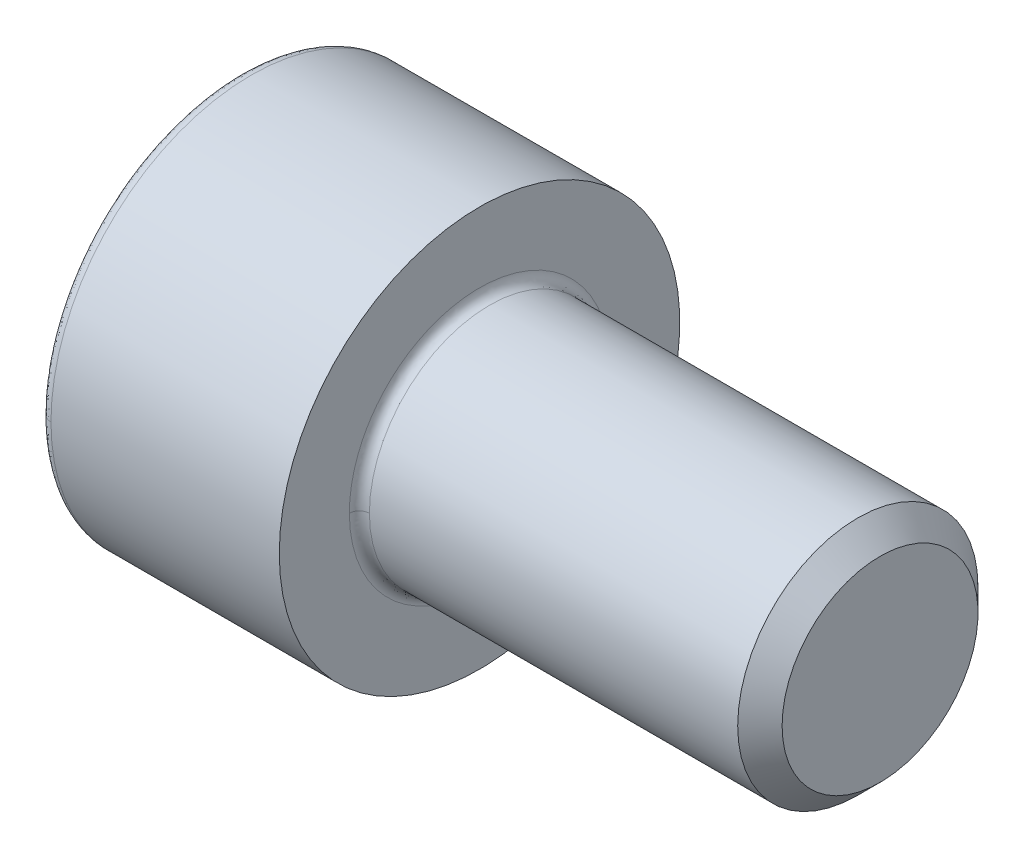
ISO-10303-21;
HEADER;
FILE_DESCRIPTION(('STEP AP214'),'2;1');
FILE_NAME('part.step','',(''),(''),'','','');
FILE_SCHEMA(('AUTOMOTIVE_DESIGN { 1 0 10303 214 1 1 1 1 }'));
ENDSEC;
DATA;
#1=APPLICATION_CONTEXT('core data for automotive mechanical design processes');
#2=APPLICATION_PROTOCOL_DEFINITION('international standard','automotive_design',2000,#1);
#3=PRODUCT_CONTEXT('',#1,'mechanical');
#4=PRODUCT('Part','Part','',(#3));
#5=PRODUCT_RELATED_PRODUCT_CATEGORY('part','',(#4));
#6=PRODUCT_DEFINITION_FORMATION('','',#4);
#7=PRODUCT_DEFINITION_CONTEXT('part definition',#1,'design');
#8=PRODUCT_DEFINITION('design','',#6,#7);
#9=PRODUCT_DEFINITION_SHAPE('','',#8);
#10=(LENGTH_UNIT() NAMED_UNIT(*) SI_UNIT(.MILLI.,.METRE.));
#11=(NAMED_UNIT(*) PLANE_ANGLE_UNIT() SI_UNIT($,.RADIAN.));
#12=(NAMED_UNIT(*) SI_UNIT($,.STERADIAN.) SOLID_ANGLE_UNIT());
#13=UNCERTAINTY_MEASURE_WITH_UNIT(LENGTH_MEASURE(1.E-05),#10,'distance_accuracy_value','');
#14=(GEOMETRIC_REPRESENTATION_CONTEXT(3) GLOBAL_UNCERTAINTY_ASSIGNED_CONTEXT((#13)) GLOBAL_UNIT_ASSIGNED_CONTEXT((#10,
#11,#12)) REPRESENTATION_CONTEXT('',''));
#15=CARTESIAN_POINT('',(0.,0.,0.));
#16=DIRECTION('',(0.,0.,1.));
#17=DIRECTION('',(1.,0.,0.));
#18=AXIS2_PLACEMENT_3D('',#15,#16,#17);
#19=CARTESIAN_POINT('',(16.,-2.474846,2.474846));
#20=DIRECTION('',(1.,0.,0.));
#21=DIRECTION('',(0.,0.,-1.));
#22=AXIS2_PLACEMENT_3D('',#19,#20,#21);
#23=PLANE('',#22);
#24=CARTESIAN_POINT('',(16.,0.,0.));
#25=DIRECTION('',(-1.,0.,0.));
#26=DIRECTION('',(0.,0.,1.));
#27=AXIS2_PLACEMENT_3D('',#24,#25,#26);
#28=CIRCLE('',#27,2.44549999999999);
#29=CARTESIAN_POINT('',(16.,0.,2.44549999999999));
#30=VERTEX_POINT('',#29);
#31=EDGE_CURVE('E21',#30,#30,#28,.F.);
#32=ORIENTED_EDGE('',*,*,#31,.T.);
#33=EDGE_LOOP('',(#32));
#34=FACE_BOUND('',#33,.T.);
#35=ADVANCED_FACE('F17',(#34),#23,.T.);
#36=CARTESIAN_POINT('',(16.,0.,0.));
#37=DIRECTION('',(-1.,0.,0.));
#38=DIRECTION('',(0.,0.,1.));
#39=AXIS2_PLACEMENT_3D('',#36,#37,#38);
#40=CONICAL_SURFACE('',#39,2.4455,0.785398163397449);
#41=CARTESIAN_POINT('',(15.4455,0.,0.));
#42=DIRECTION('',(-1.,0.,0.));
#43=DIRECTION('',(0.,0.,1.));
#44=AXIS2_PLACEMENT_3D('',#41,#42,#43);
#45=CIRCLE('',#44,3.);
#46=CARTESIAN_POINT('',(15.4455,0.,3.));
#47=VERTEX_POINT('',#46);
#48=EDGE_CURVE('E331',#47,#47,#45,.F.);
#49=ORIENTED_EDGE('',*,*,#48,.T.);
#50=EDGE_LOOP('',(#49));
#51=FACE_BOUND('',#50,.T.);
#52=ORIENTED_EDGE('',*,*,#31,.F.);
#53=EDGE_LOOP('',(#52));
#54=FACE_BOUND('',#53,.T.);
#55=ADVANCED_FACE('F421',(#51,#54),#40,.T.);
#56=CARTESIAN_POINT('',(15.4455,0.,0.));
#57=DIRECTION('',(-1.,0.,0.));
#58=DIRECTION('',(0.,0.,1.));
#59=AXIS2_PLACEMENT_3D('',#56,#57,#58);
#60=CYLINDRICAL_SURFACE('',#59,3.);
#61=CARTESIAN_POINT('',(6.24999999978248,0.,0.));
#62=DIRECTION('',(1.,0.,0.));
#63=DIRECTION('',(0.,0.,-1.));
#64=AXIS2_PLACEMENT_3D('',#61,#62,#63);
#65=CIRCLE('',#64,3.00000000023549);
#66=CARTESIAN_POINT('',(6.24999999978248,-3.07655142772997E-10,-3.00000000017662));
#67=VERTEX_POINT('',#66);
#68=CARTESIAN_POINT('',(6.24999999983686,0.,3.00000000017662));
#69=VERTEX_POINT('',#68);
#70=EDGE_CURVE('E334',#67,#69,#65,.T.);
#71=ORIENTED_EDGE('',*,*,#70,.T.);
#72=CARTESIAN_POINT('',(6.24999999978248,0.,0.));
#73=DIRECTION('',(1.,0.,0.));
#74=DIRECTION('',(0.,0.,-1.));
#75=AXIS2_PLACEMENT_3D('',#72,#73,#74);
#76=CIRCLE('',#75,3.00000000023549);
#77=EDGE_CURVE('E323',#69,#67,#76,.T.);
#78=ORIENTED_EDGE('',*,*,#77,.T.);
#79=EDGE_LOOP('',(#71,#78));
#80=FACE_BOUND('',#79,.T.);
#81=ORIENTED_EDGE('',*,*,#48,.F.);
#82=EDGE_LOOP('',(#81));
#83=FACE_BOUND('',#82,.T.);
#84=ADVANCED_FACE('F308',(#80,#83),#60,.T.);
#85=CARTESIAN_POINT('',(6.001248959,0.,3.274958354));
#86=CARTESIAN_POINT('',(6.001248959,-6.549916708,3.274958354));
#87=CARTESIAN_POINT('',(6.001248959,-6.549916708,-3.274958354));
#88=CARTESIAN_POINT('',(6.001248959,0.,-3.274958354));
#89=CARTESIAN_POINT('',(5.984194894,0.,3.104986559));
#90=CARTESIAN_POINT('',(5.984194894,-6.209973117,3.104986559));
#91=CARTESIAN_POINT('',(5.984194894,-6.209973117,-3.104986559));
#92=CARTESIAN_POINT('',(5.984194894,0.,-3.104986559));
#93=CARTESIAN_POINT('',(6.104986559,0.,2.984194894));
#94=CARTESIAN_POINT('',(6.104986559,-5.968389789,2.984194894));
#95=CARTESIAN_POINT('',(6.104986559,-5.968389789,-2.984194894));
#96=CARTESIAN_POINT('',(6.104986559,0.,-2.984194894));
#97=CARTESIAN_POINT('',(6.274958354,0.,3.001248959));
#98=CARTESIAN_POINT('',(6.274958354,-6.002497917,3.001248959));
#99=CARTESIAN_POINT('',(6.274958354,-6.002497917,-3.001248959));
#100=CARTESIAN_POINT('',(6.274958354,0.,-3.001248959));
#101=(BOUNDED_SURFACE() B_SPLINE_SURFACE(3,3,((#85,#86,#87,#88),(#89,#90,#91,#92),(#93,#94,#95,
#96),(#97,#98,#99,#100)),.UNSPECIFIED.,.F.,.F.,.F.) B_SPLINE_SURFACE_WITH_KNOTS((4,4),(4,4),(0.,
1.),(0.,1.),.UNSPECIFIED.) GEOMETRIC_REPRESENTATION_ITEM() RATIONAL_B_SPLINE_SURFACE(((1.,
0.333333333333333,0.333333333333333,1.),(0.755320871117972,0.251773623705991,0.251773623705991,
0.755320871117972),(0.755320871117972,0.251773623705991,0.251773623705991,0.755320871117972),
(1.,0.333333333333333,0.333333333333333,1.))) REPRESENTATION_ITEM('') SURFACE());
#102=CARTESIAN_POINT('',(6.001248959,0.,3.274958354));
#103=CARTESIAN_POINT('',(5.984194894,0.,3.104986559));
#104=CARTESIAN_POINT('',(6.104986559,0.,2.984194894));
#105=CARTESIAN_POINT('',(6.274958354,0.,3.001248959));
#106=(BOUNDED_CURVE() B_SPLINE_CURVE(3,(#102,#103,#104,#105),.UNSPECIFIED.,.F.,
.F.) B_SPLINE_CURVE_WITH_KNOTS((4,4),(0.,1.),
.UNSPECIFIED.) CURVE() GEOMETRIC_REPRESENTATION_ITEM() RATIONAL_B_SPLINE_CURVE((1.,
0.755320871117972,0.755320871117972,1.)) REPRESENTATION_ITEM(''));
#107=CARTESIAN_POINT('',(6.00000000014129,0.,3.24999999964183));
#108=VERTEX_POINT('',#107);
#109=EDGE_CURVE('E283',#69,#108,#106,.F.);
#110=CARTESIAN_POINT('',(6.00000000023549,0.,3.24999999981333));
#111=CARTESIAN_POINT('',(6.00000000023549,-6.49999999950396,3.24999999981333));
#112=CARTESIAN_POINT('',(6.00000000023549,-6.49999999950396,-3.24999999981333));
#113=CARTESIAN_POINT('',(6.00000000023549,0.,-3.24999999981333));
#114=(BOUNDED_CURVE() B_SPLINE_CURVE(3,(#110,#111,#112,#113),.UNSPECIFIED.,.F.,
.F.) B_SPLINE_CURVE_WITH_KNOTS((4,4),(0.,1.),
.UNSPECIFIED.) CURVE() GEOMETRIC_REPRESENTATION_ITEM() RATIONAL_B_SPLINE_CURVE((0.95657830221489,
0.31885943407163,0.31885943407163,0.95657830221489)) REPRESENTATION_ITEM(''));
#115=CARTESIAN_POINT('',(6.00000000014129,0.,-3.24999999964183));
#116=VERTEX_POINT('',#115);
#117=EDGE_CURVE('E343',#116,#108,#114,.F.);
#118=CARTESIAN_POINT('',(6.001248959,0.,-3.274958354));
#119=CARTESIAN_POINT('',(5.984194894,0.,-3.104986559));
#120=CARTESIAN_POINT('',(6.104986559,0.,-2.984194894));
#121=CARTESIAN_POINT('',(6.274958354,0.,-3.001248959));
#122=(BOUNDED_CURVE() B_SPLINE_CURVE(3,(#118,#119,#120,#121),.UNSPECIFIED.,.F.,
.F.) B_SPLINE_CURVE_WITH_KNOTS((4,4),(0.,1.),
.UNSPECIFIED.) CURVE() GEOMETRIC_REPRESENTATION_ITEM() RATIONAL_B_SPLINE_CURVE((1.,
0.755320871117972,0.755320871117972,1.)) REPRESENTATION_ITEM(''));
#123=EDGE_CURVE('E330',#116,#67,#122,.T.);
#124=ORIENTED_EDGE('',*,*,#109,.T.);
#125=ORIENTED_EDGE('',*,*,#117,.F.);
#126=ORIENTED_EDGE('',*,*,#123,.T.);
#127=ORIENTED_EDGE('',*,*,#77,.F.);
#128=EDGE_LOOP('',(#124,#125,#126,#127));
#129=FACE_BOUND('',#128,.T.);
#130=ADVANCED_FACE('F297',(#129),#101,.F.);
#131=CARTESIAN_POINT('',(6.001248959,0.,-3.274958354));
#132=CARTESIAN_POINT('',(6.001248959,6.549916708,-3.274958354));
#133=CARTESIAN_POINT('',(6.001248959,6.549916708,3.274958354));
#134=CARTESIAN_POINT('',(6.001248959,0.,3.274958354));
#135=CARTESIAN_POINT('',(5.984194894,0.,-3.104986559));
#136=CARTESIAN_POINT('',(5.984194894,6.209973117,-3.104986559));
#137=CARTESIAN_POINT('',(5.984194894,6.209973117,3.104986559));
#138=CARTESIAN_POINT('',(5.984194894,0.,3.104986559));
#139=CARTESIAN_POINT('',(6.104986559,0.,-2.984194894));
#140=CARTESIAN_POINT('',(6.104986559,5.968389789,-2.984194894));
#141=CARTESIAN_POINT('',(6.104986559,5.968389789,2.984194894));
#142=CARTESIAN_POINT('',(6.104986559,0.,2.984194894));
#143=CARTESIAN_POINT('',(6.274958354,0.,-3.001248959));
#144=CARTESIAN_POINT('',(6.274958354,6.002497917,-3.001248959));
#145=CARTESIAN_POINT('',(6.274958354,6.002497917,3.001248959));
#146=CARTESIAN_POINT('',(6.274958354,0.,3.001248959));
#147=(BOUNDED_SURFACE() B_SPLINE_SURFACE(3,3,((#131,#132,#133,#134),(#135,#136,#137,#138),(#139,
#140,#141,#142),(#143,#144,#145,#146)),.UNSPECIFIED.,.F.,.F.,
.F.) B_SPLINE_SURFACE_WITH_KNOTS((4,4),(4,4),(0.,1.),(0.,1.),
.UNSPECIFIED.) GEOMETRIC_REPRESENTATION_ITEM() RATIONAL_B_SPLINE_SURFACE(((1.,0.333333333333333,
0.333333333333333,1.),(0.755320871117972,0.251773623705991,0.251773623705991,0.755320871117972),
(0.755320871117972,0.251773623705991,0.251773623705991,0.755320871117972),(1.,0.333333333333333,
0.333333333333333,1.))) REPRESENTATION_ITEM('') SURFACE());
#148=CARTESIAN_POINT('',(6.00000000023549,0.,-3.24999999981333));
#149=CARTESIAN_POINT('',(6.00000000023549,6.49999999950396,-3.24999999981333));
#150=CARTESIAN_POINT('',(6.00000000023549,6.49999999950396,3.24999999981333));
#151=CARTESIAN_POINT('',(6.00000000023549,0.,3.24999999981333));
#152=(BOUNDED_CURVE() B_SPLINE_CURVE(3,(#148,#149,#150,#151),.UNSPECIFIED.,.F.,
.F.) B_SPLINE_CURVE_WITH_KNOTS((4,4),(0.,1.),
.UNSPECIFIED.) CURVE() GEOMETRIC_REPRESENTATION_ITEM() RATIONAL_B_SPLINE_CURVE((0.956578302214891,
0.31885943407163,0.31885943407163,0.956578302214891)) REPRESENTATION_ITEM(''));
#153=EDGE_CURVE('E279',#108,#116,#152,.F.);
#154=ORIENTED_EDGE('',*,*,#70,.F.);
#155=ORIENTED_EDGE('',*,*,#123,.F.);
#156=ORIENTED_EDGE('',*,*,#153,.F.);
#157=ORIENTED_EDGE('',*,*,#109,.F.);
#158=EDGE_LOOP('',(#154,#155,#156,#157));
#159=FACE_BOUND('',#158,.T.);
#160=ADVANCED_FACE('F285',(#159),#147,.F.);
#161=CARTESIAN_POINT('',(6.,-5.06,5.06));
#162=DIRECTION('',(1.,0.,0.));
#163=DIRECTION('',(0.,0.,-1.));
#164=AXIS2_PLACEMENT_3D('',#161,#162,#163);
#165=PLANE('',#164);
#166=ORIENTED_EDGE('',*,*,#117,.T.);
#167=ORIENTED_EDGE('',*,*,#153,.T.);
#168=EDGE_LOOP('',(#166,#167));
#169=FACE_BOUND('',#168,.T.);
#170=CARTESIAN_POINT('',(6.,0.,0.));
#171=DIRECTION('',(-1.,0.,0.));
#172=DIRECTION('',(0.,0.,1.));
#173=AXIS2_PLACEMENT_3D('',#170,#171,#172);
#174=CIRCLE('',#173,5.);
#175=CARTESIAN_POINT('',(6.,0.,5.));
#176=VERTEX_POINT('',#175);
#177=EDGE_CURVE('E267',#176,#176,#174,.F.);
#178=ORIENTED_EDGE('',*,*,#177,.T.);
#179=EDGE_LOOP('',(#178));
#180=FACE_BOUND('',#179,.T.);
#181=ADVANCED_FACE('F296',(#169,#180),#165,.T.);
#182=CARTESIAN_POINT('',(6.,0.,0.));
#183=DIRECTION('',(-1.,0.,0.));
#184=DIRECTION('',(0.,0.,1.));
#185=AXIS2_PLACEMENT_3D('',#182,#183,#184);
#186=CYLINDRICAL_SURFACE('',#185,5.);
#187=ORIENTED_EDGE('',*,*,#177,.F.);
#188=EDGE_LOOP('',(#187));
#189=FACE_BOUND('',#188,.T.);
#190=CARTESIAN_POINT('',(0.29999999980743,0.,0.));
#191=DIRECTION('',(-1.,0.,0.));
#192=DIRECTION('',(0.,-1.,0.));
#193=AXIS2_PLACEMENT_3D('',#190,#191,#192);
#194=CIRCLE('',#193,5.00000000038587);
#195=CARTESIAN_POINT('',(0.299999999855573,-2.24484071071833E-10,5.0000000002894));
#196=VERTEX_POINT('',#195);
#197=CARTESIAN_POINT('',(0.29999999980743,-5.12758571288328E-10,-5.0000000002894));
#198=VERTEX_POINT('',#197);
#199=EDGE_CURVE('E264',#196,#198,#194,.T.);
#200=ORIENTED_EDGE('',*,*,#199,.F.);
#201=CARTESIAN_POINT('',(0.29999999980743,0.,0.));
#202=DIRECTION('',(-1.,0.,0.));
#203=DIRECTION('',(0.,-1.,0.));
#204=AXIS2_PLACEMENT_3D('',#201,#202,#203);
#205=CIRCLE('',#204,5.00000000038587);
#206=EDGE_CURVE('E270',#198,#196,#205,.T.);
#207=ORIENTED_EDGE('',*,*,#206,.F.);
#208=EDGE_LOOP('',(#200,#207));
#209=FACE_BOUND('',#208,.T.);
#210=ADVANCED_FACE('F216',(#189,#209),#186,.T.);
#211=CARTESIAN_POINT('',(0.00149875,0.,4.670049975));
#212=CARTESIAN_POINT('',(0.00149875,9.34009995,4.670049975));
#213=CARTESIAN_POINT('',(0.00149875,9.34009995,-4.670049975));
#214=CARTESIAN_POINT('',(0.00149875,0.,-4.670049975));
#215=CARTESIAN_POINT('',(-0.018966127,0.,4.87401613));
#216=CARTESIAN_POINT('',(-0.018966127,9.748032259,4.87401613));
#217=CARTESIAN_POINT('',(-0.018966127,9.748032259,-4.87401613));
#218=CARTESIAN_POINT('',(-0.018966127,0.,-4.87401613));
#219=CARTESIAN_POINT('',(0.12598387,0.,5.018966127));
#220=CARTESIAN_POINT('',(0.12598387,10.037932254,5.018966127));
#221=CARTESIAN_POINT('',(0.12598387,10.037932254,-5.018966127));
#222=CARTESIAN_POINT('',(0.12598387,0.,-5.018966127));
#223=CARTESIAN_POINT('',(0.329950025,0.,4.99850125));
#224=CARTESIAN_POINT('',(0.329950025,9.997002499,4.99850125));
#225=CARTESIAN_POINT('',(0.329950025,9.997002499,-4.99850125));
#226=CARTESIAN_POINT('',(0.329950025,0.,-4.99850125));
#227=(BOUNDED_SURFACE() B_SPLINE_SURFACE(3,3,((#211,#212,#213,#214),(#215,#216,#217,#218),(#219,
#220,#221,#222),(#223,#224,#225,#226)),.UNSPECIFIED.,.F.,.F.,
.F.) B_SPLINE_SURFACE_WITH_KNOTS((4,4),(4,4),(0.,1.),(0.,1.),
.UNSPECIFIED.) GEOMETRIC_REPRESENTATION_ITEM() RATIONAL_B_SPLINE_SURFACE(((1.,0.333333333333333,
0.333333333333333,1.),(0.755320871117972,0.251773623705991,0.251773623705991,0.755320871117972),
(0.755320871117972,0.251773623705991,0.251773623705991,0.755320871117972),(1.,0.333333333333333,
0.333333333333333,1.))) REPRESENTATION_ITEM('') SURFACE());
#228=CARTESIAN_POINT('',(-3.85867261707578E-10,0.,-4.70000000022572));
#229=CARTESIAN_POINT('',(-3.85867264776779E-10,9.4000000003199,-4.70000000022572));
#230=CARTESIAN_POINT('',(-3.85867264776779E-10,9.4000000003199,4.70000000022572));
#231=CARTESIAN_POINT('',(-3.85867261707578E-10,0.,4.70000000022572));
#232=(BOUNDED_CURVE() B_SPLINE_CURVE(3,(#228,#229,#230,#231),.UNSPECIFIED.,.F.,
.F.) B_SPLINE_CURVE_WITH_KNOTS((4,4),(0.,1.),
.UNSPECIFIED.) CURVE() GEOMETRIC_REPRESENTATION_ITEM() RATIONAL_B_SPLINE_CURVE((0.95657830212221,
0.318859434040737,0.318859434040737,0.95657830212221)) REPRESENTATION_ITEM(''));
#233=CARTESIAN_POINT('',(-2.3152035707117E-10,0.,4.69999999919632));
#234=VERTEX_POINT('',#233);
#235=CARTESIAN_POINT('',(-2.3152035707117E-10,0.,-4.69999999919632));
#236=VERTEX_POINT('',#235);
#237=EDGE_CURVE('E157',#234,#236,#232,.F.);
#238=CARTESIAN_POINT('',(0.00149875,0.,4.670049975));
#239=CARTESIAN_POINT('',(-0.018966127,0.,4.87401613));
#240=CARTESIAN_POINT('',(0.12598387,0.,5.018966127));
#241=CARTESIAN_POINT('',(0.329950025,0.,4.99850125));
#242=(BOUNDED_CURVE() B_SPLINE_CURVE(3,(#238,#239,#240,#241),.UNSPECIFIED.,.F.,
.F.) B_SPLINE_CURVE_WITH_KNOTS((4,4),(0.,1.),
.UNSPECIFIED.) CURVE() GEOMETRIC_REPRESENTATION_ITEM() RATIONAL_B_SPLINE_CURVE((1.,
0.755320871117972,0.755320871117972,1.)) REPRESENTATION_ITEM(''));
#243=EDGE_CURVE('E189',#196,#234,#242,.F.);
#244=CARTESIAN_POINT('',(0.00149875,0.,-4.670049975));
#245=CARTESIAN_POINT('',(-0.018966127,0.,-4.87401613));
#246=CARTESIAN_POINT('',(0.12598387,0.,-5.018966127));
#247=CARTESIAN_POINT('',(0.329950025,0.,-4.99850125));
#248=(BOUNDED_CURVE() B_SPLINE_CURVE(3,(#244,#245,#246,#247),.UNSPECIFIED.,.F.,
.F.) B_SPLINE_CURVE_WITH_KNOTS((4,4),(0.,1.),
.UNSPECIFIED.) CURVE() GEOMETRIC_REPRESENTATION_ITEM() RATIONAL_B_SPLINE_CURVE((1.,
0.755320871117972,0.755320871117972,1.)) REPRESENTATION_ITEM(''));
#249=EDGE_CURVE('E266',#236,#198,#248,.T.);
#250=ORIENTED_EDGE('',*,*,#237,.F.);
#251=ORIENTED_EDGE('',*,*,#243,.F.);
#252=ORIENTED_EDGE('',*,*,#199,.T.);
#253=ORIENTED_EDGE('',*,*,#249,.F.);
#254=EDGE_LOOP('',(#250,#251,#252,#253));
#255=FACE_BOUND('',#254,.T.);
#256=ADVANCED_FACE('F204',(#255),#227,.T.);
#257=CARTESIAN_POINT('',(0.00149875,0.,-4.670049975));
#258=CARTESIAN_POINT('',(0.00149875,-9.34009995,-4.670049975));
#259=CARTESIAN_POINT('',(0.00149875,-9.34009995,4.670049975));
#260=CARTESIAN_POINT('',(0.00149875,0.,4.670049975));
#261=CARTESIAN_POINT('',(-0.018966127,0.,-4.87401613));
#262=CARTESIAN_POINT('',(-0.018966127,-9.748032259,-4.87401613));
#263=CARTESIAN_POINT('',(-0.018966127,-9.748032259,4.87401613));
#264=CARTESIAN_POINT('',(-0.018966127,0.,4.87401613));
#265=CARTESIAN_POINT('',(0.12598387,0.,-5.018966127));
#266=CARTESIAN_POINT('',(0.12598387,-10.037932254,-5.018966127));
#267=CARTESIAN_POINT('',(0.12598387,-10.037932254,5.018966127));
#268=CARTESIAN_POINT('',(0.12598387,0.,5.018966127));
#269=CARTESIAN_POINT('',(0.329950025,0.,-4.99850125));
#270=CARTESIAN_POINT('',(0.329950025,-9.997002499,-4.99850125));
#271=CARTESIAN_POINT('',(0.329950025,-9.997002499,4.99850125));
#272=CARTESIAN_POINT('',(0.329950025,0.,4.99850125));
#273=(BOUNDED_SURFACE() B_SPLINE_SURFACE(3,3,((#257,#258,#259,#260),(#261,#262,#263,#264),(#265,
#266,#267,#268),(#269,#270,#271,#272)),.UNSPECIFIED.,.F.,.F.,
.F.) B_SPLINE_SURFACE_WITH_KNOTS((4,4),(4,4),(0.,1.),(0.,1.),
.UNSPECIFIED.) GEOMETRIC_REPRESENTATION_ITEM() RATIONAL_B_SPLINE_SURFACE(((1.,0.333333333333333,
0.333333333333333,1.),(0.755320871117972,0.251773623705991,0.251773623705991,0.755320871117972),
(0.755320871117972,0.251773623705991,0.251773623705991,0.755320871117972),(1.,0.333333333333333,
0.333333333333333,1.))) REPRESENTATION_ITEM('') SURFACE());
#274=CARTESIAN_POINT('',(-3.85867261925231E-10,0.,4.70000000022572));
#275=CARTESIAN_POINT('',(-3.85867264679281E-10,-9.4000000003199,4.70000000022572));
#276=CARTESIAN_POINT('',(-3.85867264679281E-10,-9.4000000003199,-4.70000000022572));
#277=CARTESIAN_POINT('',(-3.85867261925231E-10,0.,-4.70000000022572));
#278=(BOUNDED_CURVE() B_SPLINE_CURVE(3,(#274,#275,#276,#277),.UNSPECIFIED.,.F.,
.F.) B_SPLINE_CURVE_WITH_KNOTS((4,4),(0.,1.),
.UNSPECIFIED.) CURVE() GEOMETRIC_REPRESENTATION_ITEM() RATIONAL_B_SPLINE_CURVE((0.95657830212221,
0.318859434040737,0.318859434040737,0.95657830212221)) REPRESENTATION_ITEM(''));
#279=EDGE_CURVE('E132',#236,#234,#278,.F.);
#280=ORIENTED_EDGE('',*,*,#243,.T.);
#281=ORIENTED_EDGE('',*,*,#279,.F.);
#282=ORIENTED_EDGE('',*,*,#249,.T.);
#283=ORIENTED_EDGE('',*,*,#206,.T.);
#284=EDGE_LOOP('',(#280,#281,#282,#283));
#285=FACE_BOUND('',#284,.T.);
#286=ADVANCED_FACE('F191',(#285),#273,.T.);
#287=CARTESIAN_POINT('',(0.,1.467624384,2.542));
#288=DIRECTION('',(0.,0.,1.));
#289=DIRECTION('',(0.,-1.,0.));
#290=AXIS2_PLACEMENT_3D('',#287,#288,#289);
#291=PLANE('',#290);
#292=DIRECTION('',(-1.,0.,0.));
#293=VECTOR('',#292,1.);
#294=CARTESIAN_POINT('',(1.5,1.467624384,2.542));
#295=LINE('',#294,#293);
#296=CARTESIAN_POINT('',(3.,1.467624384,2.542));
#297=VERTEX_POINT('',#296);
#298=CARTESIAN_POINT('',(0.,1.4676243852548,2.541999999613));
#299=VERTEX_POINT('',#298);
#300=EDGE_CURVE('E128',#297,#299,#295,.T.);
#301=ORIENTED_EDGE('',*,*,#300,.F.);
#302=DIRECTION('',(0.,1.,0.));
#303=VECTOR('',#302,1.);
#304=CARTESIAN_POINT('',(3.,0.,2.542));
#305=LINE('',#304,#303);
#306=CARTESIAN_POINT('',(3.,-2.28255403465839E-10,2.542));
#307=VERTEX_POINT('',#306);
#308=EDGE_CURVE('E172',#307,#297,#305,.T.);
#309=ORIENTED_EDGE('',*,*,#308,.F.);
#310=DIRECTION('',(0.,1.,0.));
#311=VECTOR('',#310,1.);
#312=CARTESIAN_POINT('',(3.,0.,2.542));
#313=LINE('',#312,#311);
#314=CARTESIAN_POINT('',(3.,-1.467624384,2.542));
#315=VERTEX_POINT('',#314);
#316=EDGE_CURVE('E245',#315,#307,#313,.T.);
#317=ORIENTED_EDGE('',*,*,#316,.F.);
#318=DIRECTION('',(1.,0.,0.));
#319=VECTOR('',#318,1.);
#320=CARTESIAN_POINT('',(1.5,-1.467624384,2.542));
#321=LINE('',#320,#319);
#322=CARTESIAN_POINT('',(0.,-1.4676243852548,2.541999999613));
#323=VERTEX_POINT('',#322);
#324=EDGE_CURVE('E168',#323,#315,#321,.T.);
#325=ORIENTED_EDGE('',*,*,#324,.F.);
#326=DIRECTION('',(0.,-1.,0.));
#327=VECTOR('',#326,1.);
#328=CARTESIAN_POINT('',(0.,0.,2.541999999484));
#329=LINE('',#328,#327);
#330=EDGE_CURVE('E131',#299,#323,#329,.T.);
#331=ORIENTED_EDGE('',*,*,#330,.F.);
#332=EDGE_LOOP('',(#301,#309,#317,#325,#331));
#333=FACE_BOUND('',#332,.T.);
#334=ADVANCED_FACE('F203',(#333),#291,.F.);
#335=CARTESIAN_POINT('',(0.,-2.935248769,0.));
#336=DIRECTION('',(0.,0.866025403678227,-0.500000000183963));
#337=DIRECTION('',(0.,0.500000000183963,0.866025403678227));
#338=AXIS2_PLACEMENT_3D('',#335,#336,#337);
#339=PLANE('',#338);
#340=DIRECTION('',(0.,-0.500000000183963,-0.866025403678227));
#341=VECTOR('',#340,1.);
#342=CARTESIAN_POINT('',(3.,-2.2014365765,1.271));
#343=LINE('',#342,#341);
#344=CARTESIAN_POINT('',(3.,-2.20143657635501,1.27100000025113));
#345=VERTEX_POINT('',#344);
#346=CARTESIAN_POINT('',(3.,-2.935248769,0.));
#347=VERTEX_POINT('',#346);
#348=EDGE_CURVE('E165',#345,#347,#343,.T.);
#349=ORIENTED_EDGE('',*,*,#348,.T.);
#350=DIRECTION('',(1.,0.,0.));
#351=VECTOR('',#350,1.);
#352=CARTESIAN_POINT('',(1.5,-2.935248769,0.));
#353=LINE('',#352,#351);
#354=CARTESIAN_POINT('',(0.,-2.9352487717632,4.35090866656742E-10));
#355=VERTEX_POINT('',#354);
#356=EDGE_CURVE('E161',#355,#347,#353,.T.);
#357=ORIENTED_EDGE('',*,*,#356,.F.);
#358=DIRECTION('',(0.,-0.50000000064581,-0.86602540341158));
#359=VECTOR('',#358,1.);
#360=CARTESIAN_POINT('',(0.,-1.4676243865096,2.541999999484));
#361=LINE('',#360,#359);
#362=EDGE_CURVE('E176',#323,#355,#361,.T.);
#363=ORIENTED_EDGE('',*,*,#362,.F.);
#364=ORIENTED_EDGE('',*,*,#324,.T.);
#365=DIRECTION('',(0.,-0.500000000183963,-0.866025403678227));
#366=VECTOR('',#365,1.);
#367=CARTESIAN_POINT('',(3.,-2.2014365765,1.271));
#368=LINE('',#367,#366);
#369=EDGE_CURVE('E171',#315,#345,#368,.T.);
#370=ORIENTED_EDGE('',*,*,#369,.T.);
#371=EDGE_LOOP('',(#349,#357,#363,#364,#370));
#372=FACE_BOUND('',#371,.T.);
#373=ADVANCED_FACE('F453',(#372),#339,.T.);
#374=CARTESIAN_POINT('',(0.,-1.467624384,-2.542));
#375=DIRECTION('',(0.,0.866025403678227,0.500000000183963));
#376=DIRECTION('',(0.,-0.500000000183963,0.866025403678227));
#377=AXIS2_PLACEMENT_3D('',#374,#375,#376);
#378=PLANE('',#377);
#379=DIRECTION('',(0.,0.500000000183963,-0.866025403678227));
#380=VECTOR('',#379,1.);
#381=CARTESIAN_POINT('',(3.,-2.2014365765,-1.271));
#382=LINE('',#381,#380);
#383=CARTESIAN_POINT('',(3.,-2.20143657645078,-1.27100000001601));
#384=VERTEX_POINT('',#383);
#385=CARTESIAN_POINT('',(3.,-1.467624384,-2.542));
#386=VERTEX_POINT('',#385);
#387=EDGE_CURVE('E153',#384,#386,#382,.T.);
#388=ORIENTED_EDGE('',*,*,#387,.T.);
#389=DIRECTION('',(-1.,0.,0.));
#390=VECTOR('',#389,1.);
#391=CARTESIAN_POINT('',(1.5,-1.467624384,-2.542));
#392=LINE('',#391,#390);
#393=CARTESIAN_POINT('',(0.,-1.4676243852548,-2.541999999613));
#394=VERTEX_POINT('',#393);
#395=EDGE_CURVE('E154',#386,#394,#392,.T.);
#396=ORIENTED_EDGE('',*,*,#395,.T.);
#397=DIRECTION('',(0.,0.50000000064581,-0.86602540341158));
#398=VECTOR('',#397,1.);
#399=CARTESIAN_POINT('',(0.,-2.9352487730192,0.));
#400=LINE('',#399,#398);
#401=EDGE_CURVE('E147',#355,#394,#400,.T.);
#402=ORIENTED_EDGE('',*,*,#401,.F.);
#403=ORIENTED_EDGE('',*,*,#356,.T.);
#404=DIRECTION('',(0.,0.500000000183963,-0.866025403678227));
#405=VECTOR('',#404,1.);
#406=CARTESIAN_POINT('',(3.,-2.2014365765,-1.271));
#407=LINE('',#406,#405);
#408=EDGE_CURVE('E164',#347,#384,#407,.T.);
#409=ORIENTED_EDGE('',*,*,#408,.T.);
#410=EDGE_LOOP('',(#388,#396,#402,#403,#409));
#411=FACE_BOUND('',#410,.T.);
#412=ADVANCED_FACE('F458',(#411),#378,.T.);
#413=CARTESIAN_POINT('',(0.,1.467624384,2.542));
#414=DIRECTION('',(0.,-0.866025403678227,-0.500000000183963));
#415=DIRECTION('',(0.,0.500000000183963,-0.866025403678227));
#416=AXIS2_PLACEMENT_3D('',#413,#414,#415);
#417=PLANE('',#416);
#418=DIRECTION('',(0.,-0.500000000183963,0.866025403678227));
#419=VECTOR('',#418,1.);
#420=CARTESIAN_POINT('',(3.,2.2014365765,1.271));
#421=LINE('',#420,#419);
#422=CARTESIAN_POINT('',(3.,2.20143657635501,1.27100000025113));
#423=VERTEX_POINT('',#422);
#424=EDGE_CURVE('E152',#423,#297,#421,.T.);
#425=ORIENTED_EDGE('',*,*,#424,.T.);
#426=ORIENTED_EDGE('',*,*,#300,.T.);
#427=DIRECTION('',(0.,-0.50000000064581,0.86602540341158));
#428=VECTOR('',#427,1.);
#429=CARTESIAN_POINT('',(0.,2.9352487730192,0.));
#430=LINE('',#429,#428);
#431=CARTESIAN_POINT('',(0.,2.9352487700048,1.74036534008449E-09));
#432=VERTEX_POINT('',#431);
#433=EDGE_CURVE('E125',#432,#299,#430,.T.);
#434=ORIENTED_EDGE('',*,*,#433,.F.);
#435=DIRECTION('',(1.,0.,0.));
#436=VECTOR('',#435,1.);
#437=CARTESIAN_POINT('',(1.5,2.935248769,0.));
#438=LINE('',#437,#436);
#439=CARTESIAN_POINT('',(3.,2.935248769,0.));
#440=VERTEX_POINT('',#439);
#441=EDGE_CURVE('E110',#432,#440,#438,.T.);
#442=ORIENTED_EDGE('',*,*,#441,.T.);
#443=DIRECTION('',(0.,-0.500000000183963,0.866025403678227));
#444=VECTOR('',#443,1.);
#445=CARTESIAN_POINT('',(3.,2.2014365765,1.271));
#446=LINE('',#445,#444);
#447=EDGE_CURVE('E150',#440,#423,#446,.T.);
#448=ORIENTED_EDGE('',*,*,#447,.T.);
#449=EDGE_LOOP('',(#425,#426,#434,#442,#448));
#450=FACE_BOUND('',#449,.T.);
#451=ADVANCED_FACE('F126',(#450),#417,.T.);
#452=CARTESIAN_POINT('',(0.,-1.467624384,-2.542));
#453=DIRECTION('',(0.,0.,-1.));
#454=DIRECTION('',(0.,1.,0.));
#455=AXIS2_PLACEMENT_3D('',#452,#453,#454);
#456=PLANE('',#455);
#457=ORIENTED_EDGE('',*,*,#395,.F.);
#458=DIRECTION('',(0.,-1.,0.));
#459=VECTOR('',#458,1.);
#460=CARTESIAN_POINT('',(3.,0.,-2.542));
#461=LINE('',#460,#459);
#462=CARTESIAN_POINT('',(3.,-5.21372915285972E-10,-2.542));
#463=VERTEX_POINT('',#462);
#464=EDGE_CURVE('E158',#463,#386,#461,.T.);
#465=ORIENTED_EDGE('',*,*,#464,.F.);
#466=DIRECTION('',(0.,-1.,0.));
#467=VECTOR('',#466,1.);
#468=CARTESIAN_POINT('',(3.,0.,-2.542));
#469=LINE('',#468,#467);
#470=CARTESIAN_POINT('',(3.,1.467624384,-2.542));
#471=VERTEX_POINT('',#470);
#472=EDGE_CURVE('E143',#471,#463,#469,.T.);
#473=ORIENTED_EDGE('',*,*,#472,.F.);
#474=DIRECTION('',(-1.,0.,0.));
#475=VECTOR('',#474,1.);
#476=CARTESIAN_POINT('',(1.5,1.467624384,-2.542));
#477=LINE('',#476,#475);
#478=CARTESIAN_POINT('',(0.,1.467624384,-2.541999999828));
#479=VERTEX_POINT('',#478);
#480=EDGE_CURVE('E120',#471,#479,#477,.T.);
#481=ORIENTED_EDGE('',*,*,#480,.T.);
#482=DIRECTION('',(0.,1.,0.));
#483=VECTOR('',#482,1.);
#484=CARTESIAN_POINT('',(0.,0.,-2.541999999484));
#485=LINE('',#484,#483);
#486=EDGE_CURVE('E121',#394,#479,#485,.T.);
#487=ORIENTED_EDGE('',*,*,#486,.F.);
#488=EDGE_LOOP('',(#457,#465,#473,#481,#487));
#489=FACE_BOUND('',#488,.T.);
#490=ADVANCED_FACE('F385',(#489),#456,.F.);
#491=CARTESIAN_POINT('',(0.,-4.7564,-4.7564));
#492=DIRECTION('',(-1.,0.,0.));
#493=DIRECTION('',(0.,0.,1.));
#494=AXIS2_PLACEMENT_3D('',#491,#492,#493);
#495=PLANE('',#494);
#496=ORIENTED_EDGE('',*,*,#486,.T.);
#497=DIRECTION('',(0.,0.500000000183963,0.866025403678227));
#498=VECTOR('',#497,1.);
#499=CARTESIAN_POINT('',(0.,2.2014365765,-1.271));
#500=LINE('',#499,#498);
#501=EDGE_CURVE('E115',#479,#432,#500,.T.);
#502=ORIENTED_EDGE('',*,*,#501,.T.);
#503=ORIENTED_EDGE('',*,*,#433,.T.);
#504=ORIENTED_EDGE('',*,*,#330,.T.);
#505=ORIENTED_EDGE('',*,*,#362,.T.);
#506=ORIENTED_EDGE('',*,*,#401,.T.);
#507=EDGE_LOOP('',(#496,#502,#503,#504,#505,#506));
#508=FACE_BOUND('',#507,.T.);
#509=ORIENTED_EDGE('',*,*,#237,.T.);
#510=ORIENTED_EDGE('',*,*,#279,.T.);
#511=EDGE_LOOP('',(#509,#510));
#512=FACE_BOUND('',#511,.T.);
#513=ADVANCED_FACE('F134',(#508,#512),#495,.T.);
#514=CARTESIAN_POINT('',(0.,1.467624384,-2.542));
#515=DIRECTION('',(0.,0.866025403678227,-0.500000000183963));
#516=DIRECTION('',(0.,0.500000000183963,0.866025403678227));
#517=AXIS2_PLACEMENT_3D('',#514,#515,#516);
#518=PLANE('',#517);
#519=ORIENTED_EDGE('',*,*,#480,.F.);
#520=DIRECTION('',(0.,0.500000000183963,0.866025403678227));
#521=VECTOR('',#520,1.);
#522=CARTESIAN_POINT('',(3.,1.467624384,-2.542));
#523=LINE('',#522,#521);
#524=CARTESIAN_POINT('',(3.,2.20143657656491,-1.27099999981833));
#525=VERTEX_POINT('',#524);
#526=EDGE_CURVE('E138',#471,#525,#523,.T.);
#527=ORIENTED_EDGE('',*,*,#526,.T.);
#528=DIRECTION('',(0.,0.500000000183963,0.866025403678227));
#529=VECTOR('',#528,1.);
#530=CARTESIAN_POINT('',(3.,1.467624384,-2.542));
#531=LINE('',#530,#529);
#532=EDGE_CURVE('E118',#525,#440,#531,.T.);
#533=ORIENTED_EDGE('',*,*,#532,.T.);
#534=ORIENTED_EDGE('',*,*,#441,.F.);
#535=ORIENTED_EDGE('',*,*,#501,.F.);
#536=EDGE_LOOP('',(#519,#527,#533,#534,#535));
#537=FACE_BOUND('',#536,.T.);
#538=ADVANCED_FACE('F113',(#537),#518,.F.);
#539=CARTESIAN_POINT('',(3.,-0.013208619,2.542));
#540=DIRECTION('',(1.,0.,0.));
#541=DIRECTION('',(0.,0.,-1.));
#542=AXIS2_PLACEMENT_3D('',#539,#540,#541);
#543=PLANE('',#542);
#544=ORIENTED_EDGE('',*,*,#424,.F.);
#545=CARTESIAN_POINT('',(3.,0.,0.));
#546=DIRECTION('',(-1.,0.,0.));
#547=DIRECTION('',(0.,0.,1.));
#548=AXIS2_PLACEMENT_3D('',#545,#546,#547);
#549=CIRCLE('',#548,2.542);
#550=EDGE_CURVE('E408',#307,#423,#549,.T.);
#551=ORIENTED_EDGE('',*,*,#550,.F.);
#552=ORIENTED_EDGE('',*,*,#308,.T.);
#553=EDGE_LOOP('',(#544,#551,#552));
#554=FACE_BOUND('',#553,.T.);
#555=ADVANCED_FACE('F464',(#554),#543,.F.);
#556=CARTESIAN_POINT('',(3.,2.197033703,1.286252));
#557=DIRECTION('',(1.,0.,0.));
#558=DIRECTION('',(0.,0.,-1.));
#559=AXIS2_PLACEMENT_3D('',#556,#557,#558);
#560=PLANE('',#559);
#561=ORIENTED_EDGE('',*,*,#532,.F.);
#562=CARTESIAN_POINT('',(3.,0.,0.));
#563=DIRECTION('',(-1.,0.,0.));
#564=DIRECTION('',(0.,0.,1.));
#565=AXIS2_PLACEMENT_3D('',#562,#563,#564);
#566=CIRCLE('',#565,2.542);
#567=EDGE_CURVE('E405',#423,#525,#566,.T.);
#568=ORIENTED_EDGE('',*,*,#567,.F.);
#569=ORIENTED_EDGE('',*,*,#447,.F.);
#570=EDGE_LOOP('',(#561,#568,#569));
#571=FACE_BOUND('',#570,.T.);
#572=ADVANCED_FACE('F481',(#571),#560,.F.);
#573=CARTESIAN_POINT('',(3.,-0.013208619,-1.263374));
#574=DIRECTION('',(1.,0.,0.));
#575=DIRECTION('',(0.,0.,-1.));
#576=AXIS2_PLACEMENT_3D('',#573,#574,#575);
#577=PLANE('',#576);
#578=ORIENTED_EDGE('',*,*,#472,.T.);
#579=CARTESIAN_POINT('',(3.,0.,0.));
#580=DIRECTION('',(-1.,0.,0.));
#581=DIRECTION('',(0.,0.,1.));
#582=AXIS2_PLACEMENT_3D('',#579,#580,#581);
#583=CIRCLE('',#582,2.542);
#584=EDGE_CURVE('E402',#525,#463,#583,.T.);
#585=ORIENTED_EDGE('',*,*,#584,.F.);
#586=ORIENTED_EDGE('',*,*,#526,.F.);
#587=EDGE_LOOP('',(#578,#585,#586));
#588=FACE_BOUND('',#587,.T.);
#589=ADVANCED_FACE('F471',(#588),#577,.F.);
#590=CARTESIAN_POINT('',(3.,-2.214645196,-1.263374));
#591=DIRECTION('',(1.,0.,0.));
#592=DIRECTION('',(0.,0.,-1.));
#593=AXIS2_PLACEMENT_3D('',#590,#591,#592);
#594=PLANE('',#593);
#595=ORIENTED_EDGE('',*,*,#387,.F.);
#596=CARTESIAN_POINT('',(3.,0.,0.));
#597=DIRECTION('',(-1.,0.,0.));
#598=DIRECTION('',(0.,0.,1.));
#599=AXIS2_PLACEMENT_3D('',#596,#597,#598);
#600=CIRCLE('',#599,2.542);
#601=EDGE_CURVE('E399',#463,#384,#600,.T.);
#602=ORIENTED_EDGE('',*,*,#601,.F.);
#603=ORIENTED_EDGE('',*,*,#464,.T.);
#604=EDGE_LOOP('',(#595,#602,#603));
#605=FACE_BOUND('',#604,.T.);
#606=ADVANCED_FACE('F474',(#605),#594,.F.);
#607=CARTESIAN_POINT('',(3.,-2.939651642,1.286252));
#608=DIRECTION('',(1.,0.,0.));
#609=DIRECTION('',(0.,0.,-1.));
#610=AXIS2_PLACEMENT_3D('',#607,#608,#609);
#611=PLANE('',#610);
#612=ORIENTED_EDGE('',*,*,#348,.F.);
#613=CARTESIAN_POINT('',(3.,0.,0.));
#614=DIRECTION('',(-1.,0.,0.));
#615=DIRECTION('',(0.,0.,1.));
#616=AXIS2_PLACEMENT_3D('',#613,#614,#615);
#617=CIRCLE('',#616,2.542);
#618=EDGE_CURVE('E27',#384,#345,#617,.T.);
#619=ORIENTED_EDGE('',*,*,#618,.F.);
#620=ORIENTED_EDGE('',*,*,#408,.F.);
#621=EDGE_LOOP('',(#612,#619,#620));
#622=FACE_BOUND('',#621,.T.);
#623=ADVANCED_FACE('F440',(#622),#611,.F.);
#624=CARTESIAN_POINT('',(3.,-2.214645196,2.542));
#625=DIRECTION('',(1.,0.,0.));
#626=DIRECTION('',(0.,0.,-1.));
#627=AXIS2_PLACEMENT_3D('',#624,#625,#626);
#628=PLANE('',#627);
#629=ORIENTED_EDGE('',*,*,#316,.T.);
#630=CARTESIAN_POINT('',(3.,0.,0.));
#631=DIRECTION('',(-1.,0.,0.));
#632=DIRECTION('',(0.,0.,1.));
#633=AXIS2_PLACEMENT_3D('',#630,#631,#632);
#634=CIRCLE('',#633,2.542);
#635=EDGE_CURVE('E11',#345,#307,#634,.T.);
#636=ORIENTED_EDGE('',*,*,#635,.F.);
#637=ORIENTED_EDGE('',*,*,#369,.F.);
#638=EDGE_LOOP('',(#629,#636,#637));
#639=FACE_BOUND('',#638,.T.);
#640=ADVANCED_FACE('F19',(#639),#628,.F.);
#641=CARTESIAN_POINT('',(4.467624384,0.,0.));
#642=DIRECTION('',(-1.,0.,0.));
#643=DIRECTION('',(0.,0.,1.));
#644=AXIS2_PLACEMENT_3D('',#641,#642,#643);
#645=CONICAL_SURFACE('',#644,0.,1.04719755127922);
#646=CARTESIAN_POINT('',(4.467624384,0.,0.));
#647=VERTEX_POINT('',#646);
#648=VERTEX_LOOP('',#647);
#649=FACE_BOUND('',#648,.T.);
#650=ORIENTED_EDGE('',*,*,#618,.T.);
#651=ORIENTED_EDGE('',*,*,#635,.T.);
#652=ORIENTED_EDGE('',*,*,#550,.T.);
#653=ORIENTED_EDGE('',*,*,#567,.T.);
#654=ORIENTED_EDGE('',*,*,#584,.T.);
#655=ORIENTED_EDGE('',*,*,#601,.T.);
#656=EDGE_LOOP('',(#650,#651,#652,#653,#654,#655));
#657=FACE_BOUND('',#656,.T.);
#658=ADVANCED_FACE('F205',(#649,#657),#645,.F.);
#659=CLOSED_SHELL('',(#35,#55,#84,#130,#160,#181,#210,#256,#286,#334,#373,#412,#451,#490,#513,
#538,#555,#572,#589,#606,#623,#640,#658));
#660=MANIFOLD_SOLID_BREP('B1',#659);
#661=ADVANCED_BREP_SHAPE_REPRESENTATION('',(#18,#660),#14);
#662=SHAPE_DEFINITION_REPRESENTATION(#9,#661);
ENDSEC;
END-ISO-10303-21;
